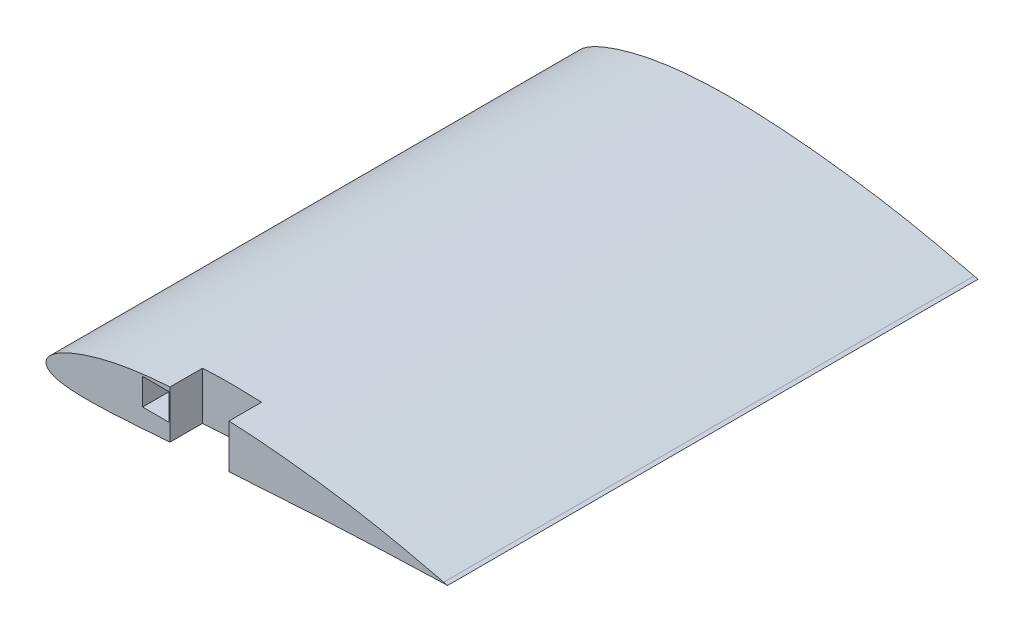
ISO-10303-21;
HEADER;
FILE_DESCRIPTION(('STEP AP214'),'2;1');
FILE_NAME('part.step','',(''),(''),'','','');
FILE_SCHEMA(('AUTOMOTIVE_DESIGN { 1 0 10303 214 1 1 1 1 }'));
ENDSEC;
DATA;
#1=APPLICATION_CONTEXT('core data for automotive mechanical design processes');
#2=APPLICATION_PROTOCOL_DEFINITION('international standard','automotive_design',2000,#1);
#3=PRODUCT_CONTEXT('',#1,'mechanical');
#4=PRODUCT('Part','Part','',(#3));
#5=PRODUCT_RELATED_PRODUCT_CATEGORY('part','',(#4));
#6=PRODUCT_DEFINITION_FORMATION('','',#4);
#7=PRODUCT_DEFINITION_CONTEXT('part definition',#1,'design');
#8=PRODUCT_DEFINITION('design','',#6,#7);
#9=PRODUCT_DEFINITION_SHAPE('','',#8);
#10=(LENGTH_UNIT() NAMED_UNIT(*) SI_UNIT(.MILLI.,.METRE.));
#11=(NAMED_UNIT(*) PLANE_ANGLE_UNIT() SI_UNIT($,.RADIAN.));
#12=(NAMED_UNIT(*) SI_UNIT($,.STERADIAN.) SOLID_ANGLE_UNIT());
#13=UNCERTAINTY_MEASURE_WITH_UNIT(LENGTH_MEASURE(1.E-05),#10,'distance_accuracy_value','');
#14=(GEOMETRIC_REPRESENTATION_CONTEXT(3) GLOBAL_UNCERTAINTY_ASSIGNED_CONTEXT((#13)) GLOBAL_UNIT_ASSIGNED_CONTEXT((#10,
#11,#12)) REPRESENTATION_CONTEXT('',''));
#15=CARTESIAN_POINT('',(0.,0.,0.));
#16=DIRECTION('',(0.,0.,1.));
#17=DIRECTION('',(1.,0.,0.));
#18=AXIS2_PLACEMENT_3D('',#15,#16,#17);
#19=CARTESIAN_POINT('',(339.238980897046,70.0443566859964,711.2));
#20=CARTESIAN_POINT('',(319.320152189869,74.7311795398603,711.2));
#21=CARTESIAN_POINT('',(279.481733705792,84.1050043243314,711.2));
#22=CARTESIAN_POINT('',(218.809486724607,93.6577328639496,711.2));
#23=CARTESIAN_POINT('',(166.111790685181,99.2728542493914,711.2));
#24=CARTESIAN_POINT('',(121.592776030725,101.653306303767,711.2));
#25=CARTESIAN_POINT('',(85.398728730595,101.744103085793,711.2));
#26=CARTESIAN_POINT('',(49.3042553718862,98.9199816607288,711.2));
#27=CARTESIAN_POINT('',(19.8264312298277,93.7360141919732,711.2));
#28=CARTESIAN_POINT('',(-2.87087470036185,87.3429297242813,711.2));
#29=CARTESIAN_POINT('',(-18.419551318698,81.6192872272217,711.2));
#30=CARTESIAN_POINT('',(-29.9679937599929,75.8760391325418,711.2));
#31=CARTESIAN_POINT('',(-37.2751246723864,70.2144056580348,711.2));
#32=CARTESIAN_POINT('',(-41.1684740354173,65.8606766636745,711.2));
#33=CARTESIAN_POINT('',(-42.307663437163,59.8303868246777,711.2));
#34=CARTESIAN_POINT('',(-38.2191163138077,55.9327974330017,711.2));
#35=CARTESIAN_POINT('',(-33.5519631279216,53.812181526751,711.2));
#36=CARTESIAN_POINT('',(-25.6974823074261,51.9262383102837,711.2));
#37=CARTESIAN_POINT('',(-14.8977814982356,50.8467262931654,711.2));
#38=CARTESIAN_POINT('',(6.42628867148243,50.4749499595248,711.2));
#39=CARTESIAN_POINT('',(35.3318026441954,51.9055082968477,711.2));
#40=CARTESIAN_POINT('',(71.7512167486906,54.724781116482,711.2));
#41=CARTESIAN_POINT('',(108.198851618384,57.255875766296,711.2));
#42=CARTESIAN_POINT('',(164.918866886951,60.7724265723506,711.2));
#43=CARTESIAN_POINT('',(241.887412204683,65.8224479087884,711.2));
#44=CARTESIAN_POINT('',(306.803946065377,67.9768364932073,711.2));
#45=CARTESIAN_POINT('',(339.262045967327,69.0540252422362,711.2));
#46=B_SPLINE_CURVE_WITH_KNOTS('',3,(#19,#20,#21,#22,#23,#24,#25,#26,#27,#28,#29,#30,#31,#32,#33,
#34,#35,#36,#37,#38,#39,#40,#41,#42,#43,#44,#45),.UNSPECIFIED.,.F.,.F.,(4,1,1,1,1,1,1,1,1,1,1,1,
1,1,1,1,1,1,1,1,1,1,1,1,4),(0.,0.0787096818024389,0.157422370988329,0.23613237959142,
0.282521124980685,0.328912647976617,0.375290452831484,0.421660744384715,0.443801161575901,
0.465921167499689,0.485410119555856,0.493052281857646,0.501408714227417,0.507595802095908,
0.514245482106216,0.520982079271332,0.5275201309318,0.545113479504854,0.562681560184092,
0.609533000460765,0.656389438992529,0.703245874107801,0.750102247849558,0.87505176690459,1.),.UNSPECIFIED.);
#47=DIRECTION('',(0.,0.,-1.));
#48=VECTOR('',#47,1.);
#49=SURFACE_OF_LINEAR_EXTRUSION('',#46,#48);
#50=CARTESIAN_POINT('',(339.238980897046,70.0443566859964,680.03));
#51=CARTESIAN_POINT('',(319.320152189869,74.7311795398603,680.03));
#52=CARTESIAN_POINT('',(279.481733705792,84.1050043243314,680.03));
#53=CARTESIAN_POINT('',(218.809486724607,93.6577328639496,680.03));
#54=CARTESIAN_POINT('',(166.111790685181,99.2728542493914,680.03));
#55=CARTESIAN_POINT('',(121.592776030725,101.653306303767,680.03));
#56=CARTESIAN_POINT('',(85.398728730595,101.744103085793,680.03));
#57=CARTESIAN_POINT('',(49.3042553718862,98.9199816607288,680.03));
#58=CARTESIAN_POINT('',(19.8264312298277,93.7360141919732,680.03));
#59=CARTESIAN_POINT('',(-2.87087470036185,87.3429297242813,680.03));
#60=CARTESIAN_POINT('',(-18.419551318698,81.6192872272217,680.03));
#61=CARTESIAN_POINT('',(-29.9679937599929,75.8760391325418,680.03));
#62=CARTESIAN_POINT('',(-37.2751246723864,70.2144056580348,680.03));
#63=CARTESIAN_POINT('',(-41.1684740354173,65.8606766636745,680.03));
#64=CARTESIAN_POINT('',(-42.307663437163,59.8303868246777,680.03));
#65=CARTESIAN_POINT('',(-38.2191163138077,55.9327974330017,680.03));
#66=CARTESIAN_POINT('',(-33.5519631279216,53.812181526751,680.03));
#67=CARTESIAN_POINT('',(-25.6974823074261,51.9262383102837,680.03));
#68=CARTESIAN_POINT('',(-14.8977814982356,50.8467262931654,680.03));
#69=CARTESIAN_POINT('',(6.42628867148243,50.4749499595248,680.03));
#70=CARTESIAN_POINT('',(35.3318026441954,51.9055082968477,680.03));
#71=CARTESIAN_POINT('',(71.7512167486906,54.724781116482,680.03));
#72=CARTESIAN_POINT('',(108.198851618384,57.255875766296,680.03));
#73=CARTESIAN_POINT('',(164.918866886951,60.7724265723506,680.03));
#74=CARTESIAN_POINT('',(241.887412204683,65.8224479087884,680.03));
#75=CARTESIAN_POINT('',(306.803946065377,67.9768364932073,680.03));
#76=CARTESIAN_POINT('',(339.262045967327,69.0540252422362,680.03));
#77=B_SPLINE_CURVE_WITH_KNOTS('',3,(#50,#51,#52,#53,#54,#55,#56,#57,#58,#59,#60,#61,#62,#63,#64,
#65,#66,#67,#68,#69,#70,#71,#72,#73,#74,#75,#76),.UNSPECIFIED.,.F.,.F.,(4,1,1,1,1,1,1,1,1,1,1,1,
1,1,1,1,1,1,1,1,1,1,1,1,4),(0.,0.0787096818024389,0.157422370988329,0.23613237959142,
0.282521124980685,0.328912647976617,0.375290452831484,0.421660744384715,0.443801161575901,
0.465921167499689,0.485410119555856,0.493052281857646,0.501408714227417,0.507595802095908,
0.514245482106216,0.520982079271332,0.5275201309318,0.545113479504854,0.562681560184092,
0.609533000460765,0.656389438992529,0.703245874107801,0.750102247849558,0.87505176690459,1.),.UNSPECIFIED.);
#78=CARTESIAN_POINT('',(133.56875,100.912528983865,680.03));
#79=VERTEX_POINT('',#78);
#80=CARTESIAN_POINT('',(77.02875,100.861394643442,680.03));
#81=VERTEX_POINT('',#80);
#82=EDGE_CURVE('E11',#79,#81,#77,.T.);
#83=ORIENTED_EDGE('',*,*,#82,.F.);
#84=DIRECTION('',(0.,0.,-1.));
#85=VECTOR('',#84,1.);
#86=CARTESIAN_POINT('',(133.56875,100.912528983865,711.2));
#87=LINE('',#86,#85);
#88=CARTESIAN_POINT('',(133.568749985279,100.912528984516,711.2));
#89=VERTEX_POINT('',#88);
#90=EDGE_CURVE('E149',#79,#89,#87,.F.);
#91=ORIENTED_EDGE('',*,*,#90,.T.);
#92=CARTESIAN_POINT('',(339.238980897046,70.0443566859964,711.2));
#93=VERTEX_POINT('',#92);
#94=EDGE_CURVE('E137',#93,#89,#46,.T.);
#95=ORIENTED_EDGE('',*,*,#94,.F.);
#96=DIRECTION('',(0.,0.,-1.));
#97=VECTOR('',#96,1.);
#98=CARTESIAN_POINT('',(339.238980897046,70.0443566859964,711.2));
#99=LINE('',#98,#97);
#100=CARTESIAN_POINT('',(339.238980897046,70.0443566859964,203.2));
#101=VERTEX_POINT('',#100);
#102=EDGE_CURVE('E167',#93,#101,#99,.T.);
#103=ORIENTED_EDGE('',*,*,#102,.T.);
#104=CARTESIAN_POINT('',(339.238980897046,70.0443566859964,203.2));
#105=CARTESIAN_POINT('',(319.320152189869,74.7311795398603,203.2));
#106=CARTESIAN_POINT('',(279.481733705792,84.1050043243314,203.2));
#107=CARTESIAN_POINT('',(218.809486724607,93.6577328639496,203.2));
#108=CARTESIAN_POINT('',(166.111790685181,99.2728542493914,203.2));
#109=CARTESIAN_POINT('',(121.592776030725,101.653306303767,203.2));
#110=CARTESIAN_POINT('',(85.398728730595,101.744103085793,203.2));
#111=CARTESIAN_POINT('',(49.3042553718862,98.9199816607288,203.2));
#112=CARTESIAN_POINT('',(19.8264312298277,93.7360141919732,203.2));
#113=CARTESIAN_POINT('',(-2.87087470036185,87.3429297242813,203.2));
#114=CARTESIAN_POINT('',(-18.419551318698,81.6192872272217,203.2));
#115=CARTESIAN_POINT('',(-29.9679937599929,75.8760391325418,203.2));
#116=CARTESIAN_POINT('',(-37.2751246723864,70.2144056580348,203.2));
#117=CARTESIAN_POINT('',(-41.1684740354173,65.8606766636745,203.2));
#118=CARTESIAN_POINT('',(-42.307663437163,59.8303868246777,203.2));
#119=CARTESIAN_POINT('',(-38.2191163138077,55.9327974330017,203.2));
#120=CARTESIAN_POINT('',(-33.5519631279216,53.812181526751,203.2));
#121=CARTESIAN_POINT('',(-25.6974823074261,51.9262383102837,203.2));
#122=CARTESIAN_POINT('',(-14.8977814982356,50.8467262931654,203.2));
#123=CARTESIAN_POINT('',(6.42628867148243,50.4749499595248,203.2));
#124=CARTESIAN_POINT('',(35.3318026441954,51.9055082968477,203.2));
#125=CARTESIAN_POINT('',(71.7512167486906,54.724781116482,203.2));
#126=CARTESIAN_POINT('',(108.198851618384,57.255875766296,203.2));
#127=CARTESIAN_POINT('',(164.918866886951,60.7724265723506,203.2));
#128=CARTESIAN_POINT('',(241.887412204683,65.8224479087884,203.2));
#129=CARTESIAN_POINT('',(306.803946065377,67.9768364932073,203.2));
#130=CARTESIAN_POINT('',(339.262045967327,69.0540252422362,203.2));
#131=B_SPLINE_CURVE_WITH_KNOTS('',3,(#104,#105,#106,#107,#108,#109,#110,#111,#112,#113,#114,
#115,#116,#117,#118,#119,#120,#121,#122,#123,#124,#125,#126,#127,#128,#129,#130),.UNSPECIFIED.,
.F.,.F.,(4,1,1,1,1,1,1,1,1,1,1,1,1,1,1,1,1,1,1,1,1,1,1,1,4),(0.,0.0787096818024389,
0.157422370988329,0.23613237959142,0.282521124980685,0.328912647976617,0.375290452831484,
0.421660744384715,0.443801161575901,0.465921167499689,0.485410119555856,0.493052281857646,
0.501408714227417,0.507595802095908,0.514245482106216,0.520982079271332,0.5275201309318,
0.545113479504854,0.562681560184092,0.609533000460765,0.656389438992529,0.703245874107801,
0.750102247849558,0.87505176690459,1.),.UNSPECIFIED.);
#132=CARTESIAN_POINT('',(339.262045967327,69.0540252422362,203.2));
#133=VERTEX_POINT('',#132);
#134=EDGE_CURVE('E174',#101,#133,#131,.T.);
#135=ORIENTED_EDGE('',*,*,#134,.T.);
#136=DIRECTION('',(0.,0.,-1.));
#137=VECTOR('',#136,1.);
#138=CARTESIAN_POINT('',(339.262045967327,69.0540252422362,711.2));
#139=LINE('',#138,#137);
#140=CARTESIAN_POINT('',(339.262045967327,69.0540252422362,711.2));
#141=VERTEX_POINT('',#140);
#142=EDGE_CURVE('E155',#141,#133,#139,.T.);
#143=ORIENTED_EDGE('',*,*,#142,.F.);
#144=CARTESIAN_POINT('',(133.56875,58.8315291038177,711.2));
#145=VERTEX_POINT('',#144);
#146=EDGE_CURVE('E134',#145,#141,#46,.T.);
#147=ORIENTED_EDGE('',*,*,#146,.F.);
#148=DIRECTION('',(0.,0.,-1.));
#149=VECTOR('',#148,1.);
#150=CARTESIAN_POINT('',(133.56875,58.8315291028375,711.2));
#151=LINE('',#150,#149);
#152=CARTESIAN_POINT('',(133.56875,58.8315291028375,680.03));
#153=VERTEX_POINT('',#152);
#154=EDGE_CURVE('E143',#145,#153,#151,.T.);
#155=ORIENTED_EDGE('',*,*,#154,.T.);
#156=CARTESIAN_POINT('',(77.02875,55.0608858859905,680.03));
#157=VERTEX_POINT('',#156);
#158=EDGE_CURVE('E50',#157,#153,#77,.T.);
#159=ORIENTED_EDGE('',*,*,#158,.F.);
#160=DIRECTION('',(0.,0.,-1.));
#161=VECTOR('',#160,1.);
#162=CARTESIAN_POINT('',(77.0287500000001,55.0608858859905,711.2));
#163=LINE('',#162,#161);
#164=CARTESIAN_POINT('',(77.02875,55.0608858859905,711.2));
#165=VERTEX_POINT('',#164);
#166=EDGE_CURVE('E192',#165,#157,#163,.T.);
#167=ORIENTED_EDGE('',*,*,#166,.F.);
#168=CARTESIAN_POINT('',(77.02875,100.861394643442,711.2));
#169=VERTEX_POINT('',#168);
#170=EDGE_CURVE('E156',#169,#165,#46,.T.);
#171=ORIENTED_EDGE('',*,*,#170,.F.);
#172=DIRECTION('',(0.,0.,-1.));
#173=VECTOR('',#172,1.);
#174=CARTESIAN_POINT('',(77.02875,100.861394643442,711.2));
#175=LINE('',#174,#173);
#176=EDGE_CURVE('E195',#81,#169,#175,.F.);
#177=ORIENTED_EDGE('',*,*,#176,.F.);
#178=EDGE_LOOP('',(#83,#91,#95,#103,#135,#143,#147,#155,#159,#167,#171,#177));
#179=FACE_BOUND('',#178,.T.);
#180=ADVANCED_FACE('F46',(#179),#49,.F.);
#181=CARTESIAN_POINT('',(0.,0.,711.2));
#182=DIRECTION('',(0.,0.,-1.));
#183=DIRECTION('',(1.,0.,0.));
#184=AXIS2_PLACEMENT_3D('',#181,#182,#183);
#185=PLANE('',#184);
#186=DIRECTION('',(-1.,0.,0.));
#187=VECTOR('',#186,1.);
#188=CARTESIAN_POINT('',(50.8,96.52,711.2));
#189=LINE('',#188,#187);
#190=CARTESIAN_POINT('',(76.2,96.52,711.2));
#191=VERTEX_POINT('',#190);
#192=CARTESIAN_POINT('',(50.8,96.52,711.2));
#193=VERTEX_POINT('',#192);
#194=EDGE_CURVE('E209',#191,#193,#189,.T.);
#195=ORIENTED_EDGE('',*,*,#194,.F.);
#196=DIRECTION('',(0.,1.,0.));
#197=VECTOR('',#196,1.);
#198=CARTESIAN_POINT('',(76.2,96.52,711.2));
#199=LINE('',#198,#197);
#200=CARTESIAN_POINT('',(76.2,71.12,711.2));
#201=VERTEX_POINT('',#200);
#202=EDGE_CURVE('E207',#201,#191,#199,.T.);
#203=ORIENTED_EDGE('',*,*,#202,.F.);
#204=DIRECTION('',(1.,0.,0.));
#205=VECTOR('',#204,1.);
#206=CARTESIAN_POINT('',(50.8,71.12,711.2));
#207=LINE('',#206,#205);
#208=CARTESIAN_POINT('',(50.8,71.12,711.2));
#209=VERTEX_POINT('',#208);
#210=EDGE_CURVE('E204',#209,#201,#207,.T.);
#211=ORIENTED_EDGE('',*,*,#210,.F.);
#212=DIRECTION('',(0.,-1.,0.));
#213=VECTOR('',#212,1.);
#214=CARTESIAN_POINT('',(50.8,96.52,711.2));
#215=LINE('',#214,#213);
#216=EDGE_CURVE('E201',#193,#209,#215,.T.);
#217=ORIENTED_EDGE('',*,*,#216,.F.);
#218=EDGE_LOOP('',(#195,#203,#211,#217));
#219=FACE_BOUND('',#218,.T.);
#220=DIRECTION('',(0.,1.,0.));
#221=VECTOR('',#220,1.);
#222=CARTESIAN_POINT('',(77.02875,0.,711.2));
#223=LINE('',#222,#221);
#224=EDGE_CURVE('E139',#165,#169,#223,.T.);
#225=ORIENTED_EDGE('',*,*,#224,.T.);
#226=ORIENTED_EDGE('',*,*,#170,.T.);
#227=EDGE_LOOP('',(#225,#226));
#228=FACE_BOUND('',#227,.T.);
#229=ADVANCED_FACE('F243',(#219,#228),#185,.F.);
#230=CARTESIAN_POINT('',(35.9041531684636,145.10184536641,711.2));
#231=DIRECTION('',(0.240197007088578,0.970724161533898,0.));
#232=DIRECTION('',(-0.970724161533898,0.240197007088578,0.));
#233=AXIS2_PLACEMENT_3D('',#230,#231,#232);
#234=PLANE('',#233);
#235=DIRECTION('',(-0.970724161533898,0.240197007088578,0.));
#236=VECTOR('',#235,1.);
#237=CARTESIAN_POINT('',(35.9041531684636,145.10184536641,203.2));
#238=LINE('',#237,#236);
#239=CARTESIAN_POINT('',(342.899999999999,69.1384702701953,203.2));
#240=VERTEX_POINT('',#239);
#241=EDGE_CURVE('E172',#240,#101,#238,.T.);
#242=ORIENTED_EDGE('',*,*,#241,.T.);
#243=ORIENTED_EDGE('',*,*,#102,.F.);
#244=DIRECTION('',(-0.970724161533898,0.240197007088578,0.));
#245=VECTOR('',#244,1.);
#246=CARTESIAN_POINT('',(35.9041531684636,145.10184536641,711.2));
#247=LINE('',#246,#245);
#248=CARTESIAN_POINT('',(342.899999999999,69.1384702701953,711.2));
#249=VERTEX_POINT('',#248);
#250=EDGE_CURVE('E157',#249,#93,#247,.T.);
#251=ORIENTED_EDGE('',*,*,#250,.F.);
#252=DIRECTION('',(0.,0.,-1.));
#253=VECTOR('',#252,1.);
#254=CARTESIAN_POINT('',(342.899999999999,69.1384702701953,711.2));
#255=LINE('',#254,#253);
#256=EDGE_CURVE('E140',#249,#240,#255,.T.);
#257=ORIENTED_EDGE('',*,*,#256,.T.);
#258=EDGE_LOOP('',(#242,#243,#251,#257));
#259=FACE_BOUND('',#258,.T.);
#260=ADVANCED_FACE('F48',(#259),#234,.T.);
#261=CARTESIAN_POINT('',(-1.419336223632,61.146050433898,711.2));
#262=DIRECTION('',(0.023205979673353,-0.9997307049938,0.));
#263=DIRECTION('',(0.9997307049938,0.023205979673353,0.));
#264=AXIS2_PLACEMENT_3D('',#261,#262,#263);
#265=PLANE('',#264);
#266=DIRECTION('',(0.9997307049938,0.023205979673353,0.));
#267=VECTOR('',#266,1.);
#268=CARTESIAN_POINT('',(-1.419336223632,61.146050433898,203.2));
#269=LINE('',#268,#267);
#270=EDGE_CURVE('E160',#133,#240,#269,.T.);
#271=ORIENTED_EDGE('',*,*,#270,.T.);
#272=ORIENTED_EDGE('',*,*,#256,.F.);
#273=DIRECTION('',(0.9997307049938,0.023205979673353,0.));
#274=VECTOR('',#273,1.);
#275=CARTESIAN_POINT('',(-1.419336223632,61.146050433898,711.2));
#276=LINE('',#275,#274);
#277=EDGE_CURVE('E166',#141,#249,#276,.T.);
#278=ORIENTED_EDGE('',*,*,#277,.F.);
#279=ORIENTED_EDGE('',*,*,#142,.T.);
#280=EDGE_LOOP('',(#271,#272,#278,#279));
#281=FACE_BOUND('',#280,.T.);
#282=ADVANCED_FACE('F261',(#281),#265,.T.);
#283=ORIENTED_EDGE('',*,*,#146,.T.);
#284=ORIENTED_EDGE('',*,*,#277,.T.);
#285=ORIENTED_EDGE('',*,*,#250,.T.);
#286=ORIENTED_EDGE('',*,*,#94,.T.);
#287=DIRECTION('',(0.,1.,0.));
#288=VECTOR('',#287,1.);
#289=CARTESIAN_POINT('',(133.56875,0.,711.2));
#290=LINE('',#289,#288);
#291=EDGE_CURVE('E63',#145,#89,#290,.T.);
#292=ORIENTED_EDGE('',*,*,#291,.F.);
#293=EDGE_LOOP('',(#283,#284,#285,#286,#292));
#294=FACE_BOUND('',#293,.T.);
#295=ADVANCED_FACE('F132',(#294),#185,.F.);
#296=CARTESIAN_POINT('',(0.,0.,203.2));
#297=DIRECTION('',(0.,0.,-1.));
#298=DIRECTION('',(1.,0.,0.));
#299=AXIS2_PLACEMENT_3D('',#296,#297,#298);
#300=PLANE('',#299);
#301=DIRECTION('',(0.,-1.,0.));
#302=VECTOR('',#301,1.);
#303=CARTESIAN_POINT('',(50.8,96.52,203.2));
#304=LINE('',#303,#302);
#305=CARTESIAN_POINT('',(50.8,96.52,203.2));
#306=VERTEX_POINT('',#305);
#307=CARTESIAN_POINT('',(50.8,71.12,203.2));
#308=VERTEX_POINT('',#307);
#309=EDGE_CURVE('E197',#306,#308,#304,.T.);
#310=ORIENTED_EDGE('',*,*,#309,.T.);
#311=DIRECTION('',(1.,0.,0.));
#312=VECTOR('',#311,1.);
#313=CARTESIAN_POINT('',(50.8,71.12,203.2));
#314=LINE('',#313,#312);
#315=CARTESIAN_POINT('',(76.2,71.12,203.2));
#316=VERTEX_POINT('',#315);
#317=EDGE_CURVE('E215',#308,#316,#314,.T.);
#318=ORIENTED_EDGE('',*,*,#317,.T.);
#319=DIRECTION('',(0.,1.,0.));
#320=VECTOR('',#319,1.);
#321=CARTESIAN_POINT('',(76.2,96.52,203.2));
#322=LINE('',#321,#320);
#323=CARTESIAN_POINT('',(76.2,96.52,203.2));
#324=VERTEX_POINT('',#323);
#325=EDGE_CURVE('E218',#316,#324,#322,.T.);
#326=ORIENTED_EDGE('',*,*,#325,.T.);
#327=DIRECTION('',(-1.,0.,0.));
#328=VECTOR('',#327,1.);
#329=CARTESIAN_POINT('',(50.8,96.52,203.2));
#330=LINE('',#329,#328);
#331=EDGE_CURVE('E205',#324,#306,#330,.T.);
#332=ORIENTED_EDGE('',*,*,#331,.T.);
#333=EDGE_LOOP('',(#310,#318,#326,#332));
#334=FACE_BOUND('',#333,.T.);
#335=ORIENTED_EDGE('',*,*,#241,.F.);
#336=ORIENTED_EDGE('',*,*,#270,.F.);
#337=ORIENTED_EDGE('',*,*,#134,.F.);
#338=EDGE_LOOP('',(#335,#336,#337));
#339=FACE_BOUND('',#338,.T.);
#340=ADVANCED_FACE('F236',(#334,#339),#300,.T.);
#341=CARTESIAN_POINT('',(50.8,96.52,711.2));
#342=DIRECTION('',(-1.,0.,0.));
#343=DIRECTION('',(0.,0.,-1.));
#344=AXIS2_PLACEMENT_3D('',#341,#342,#343);
#345=PLANE('',#344);
#346=ORIENTED_EDGE('',*,*,#309,.F.);
#347=DIRECTION('',(0.,0.,-1.));
#348=VECTOR('',#347,1.);
#349=CARTESIAN_POINT('',(50.8,96.52,711.2));
#350=LINE('',#349,#348);
#351=EDGE_CURVE('E175',#193,#306,#350,.T.);
#352=ORIENTED_EDGE('',*,*,#351,.F.);
#353=ORIENTED_EDGE('',*,*,#216,.T.);
#354=DIRECTION('',(0.,0.,-1.));
#355=VECTOR('',#354,1.);
#356=CARTESIAN_POINT('',(50.8,71.12,711.2));
#357=LINE('',#356,#355);
#358=EDGE_CURVE('E212',#209,#308,#357,.T.);
#359=ORIENTED_EDGE('',*,*,#358,.T.);
#360=EDGE_LOOP('',(#346,#352,#353,#359));
#361=FACE_BOUND('',#360,.T.);
#362=ADVANCED_FACE('F230',(#361),#345,.F.);
#363=CARTESIAN_POINT('',(50.8,96.52,711.2));
#364=DIRECTION('',(0.,1.,0.));
#365=DIRECTION('',(0.,0.,-1.));
#366=AXIS2_PLACEMENT_3D('',#363,#364,#365);
#367=PLANE('',#366);
#368=ORIENTED_EDGE('',*,*,#331,.F.);
#369=DIRECTION('',(0.,0.,-1.));
#370=VECTOR('',#369,1.);
#371=CARTESIAN_POINT('',(76.2,96.52,711.2));
#372=LINE('',#371,#370);
#373=EDGE_CURVE('E224',#191,#324,#372,.T.);
#374=ORIENTED_EDGE('',*,*,#373,.F.);
#375=ORIENTED_EDGE('',*,*,#194,.T.);
#376=ORIENTED_EDGE('',*,*,#351,.T.);
#377=EDGE_LOOP('',(#368,#374,#375,#376));
#378=FACE_BOUND('',#377,.T.);
#379=ADVANCED_FACE('F240',(#378),#367,.F.);
#380=CARTESIAN_POINT('',(76.2,96.52,711.2));
#381=DIRECTION('',(1.,0.,0.));
#382=DIRECTION('',(0.,0.,1.));
#383=AXIS2_PLACEMENT_3D('',#380,#381,#382);
#384=PLANE('',#383);
#385=ORIENTED_EDGE('',*,*,#325,.F.);
#386=DIRECTION('',(0.,0.,-1.));
#387=VECTOR('',#386,1.);
#388=CARTESIAN_POINT('',(76.2,71.12,711.2));
#389=LINE('',#388,#387);
#390=EDGE_CURVE('E71',#201,#316,#389,.T.);
#391=ORIENTED_EDGE('',*,*,#390,.F.);
#392=ORIENTED_EDGE('',*,*,#202,.T.);
#393=ORIENTED_EDGE('',*,*,#373,.T.);
#394=EDGE_LOOP('',(#385,#391,#392,#393));
#395=FACE_BOUND('',#394,.T.);
#396=ADVANCED_FACE('F245',(#395),#384,.F.);
#397=CARTESIAN_POINT('',(50.8,71.12,711.2));
#398=DIRECTION('',(0.,-1.,0.));
#399=DIRECTION('',(0.,0.,1.));
#400=AXIS2_PLACEMENT_3D('',#397,#398,#399);
#401=PLANE('',#400);
#402=ORIENTED_EDGE('',*,*,#317,.F.);
#403=ORIENTED_EDGE('',*,*,#358,.F.);
#404=ORIENTED_EDGE('',*,*,#210,.T.);
#405=ORIENTED_EDGE('',*,*,#390,.T.);
#406=EDGE_LOOP('',(#402,#403,#404,#405));
#407=FACE_BOUND('',#406,.T.);
#408=ADVANCED_FACE('F234',(#407),#401,.F.);
#409=CARTESIAN_POINT('',(77.02875,101.744103085793,711.2));
#410=DIRECTION('',(1.,0.,0.));
#411=DIRECTION('',(0.,0.,1.));
#412=AXIS2_PLACEMENT_3D('',#409,#410,#411);
#413=PLANE('',#412);
#414=DIRECTION('',(0.,-1.,0.));
#415=VECTOR('',#414,1.);
#416=CARTESIAN_POINT('',(77.02875,101.744103085793,680.03));
#417=LINE('',#416,#415);
#418=EDGE_CURVE('E150',#81,#157,#417,.T.);
#419=ORIENTED_EDGE('',*,*,#418,.F.);
#420=ORIENTED_EDGE('',*,*,#176,.T.);
#421=ORIENTED_EDGE('',*,*,#224,.F.);
#422=ORIENTED_EDGE('',*,*,#166,.T.);
#423=EDGE_LOOP('',(#419,#420,#421,#422));
#424=FACE_BOUND('',#423,.T.);
#425=ADVANCED_FACE('F252',(#424),#413,.T.);
#426=CARTESIAN_POINT('',(77.02875,101.744103085793,680.03));
#427=DIRECTION('',(0.,0.,1.));
#428=DIRECTION('',(-1.,0.,0.));
#429=AXIS2_PLACEMENT_3D('',#426,#427,#428);
#430=PLANE('',#429);
#431=DIRECTION('',(0.,-1.,0.));
#432=VECTOR('',#431,1.);
#433=CARTESIAN_POINT('',(133.56875,101.744103085793,680.03));
#434=LINE('',#433,#432);
#435=EDGE_CURVE('E145',#79,#153,#434,.T.);
#436=ORIENTED_EDGE('',*,*,#435,.F.);
#437=ORIENTED_EDGE('',*,*,#82,.T.);
#438=ORIENTED_EDGE('',*,*,#418,.T.);
#439=ORIENTED_EDGE('',*,*,#158,.T.);
#440=EDGE_LOOP('',(#436,#437,#438,#439));
#441=FACE_BOUND('',#440,.T.);
#442=ADVANCED_FACE('F188',(#441),#430,.T.);
#443=CARTESIAN_POINT('',(133.56875,101.744103085793,711.2));
#444=DIRECTION('',(1.,0.,0.));
#445=DIRECTION('',(0.,0.,1.));
#446=AXIS2_PLACEMENT_3D('',#443,#444,#445);
#447=PLANE('',#446);
#448=ORIENTED_EDGE('',*,*,#90,.F.);
#449=ORIENTED_EDGE('',*,*,#435,.T.);
#450=ORIENTED_EDGE('',*,*,#154,.F.);
#451=ORIENTED_EDGE('',*,*,#291,.T.);
#452=EDGE_LOOP('',(#448,#449,#450,#451));
#453=FACE_BOUND('',#452,.T.);
#454=ADVANCED_FACE('F144',(#453),#447,.F.);
#455=CLOSED_SHELL('',(#180,#229,#260,#282,#295,#340,#362,#379,#396,#408,#425,#442,#454));
#456=MANIFOLD_SOLID_BREP('B2',#455);
#457=ADVANCED_BREP_SHAPE_REPRESENTATION('',(#18,#456),#14);
#458=SHAPE_DEFINITION_REPRESENTATION(#9,#457);
ENDSEC;
END-ISO-10303-21;
